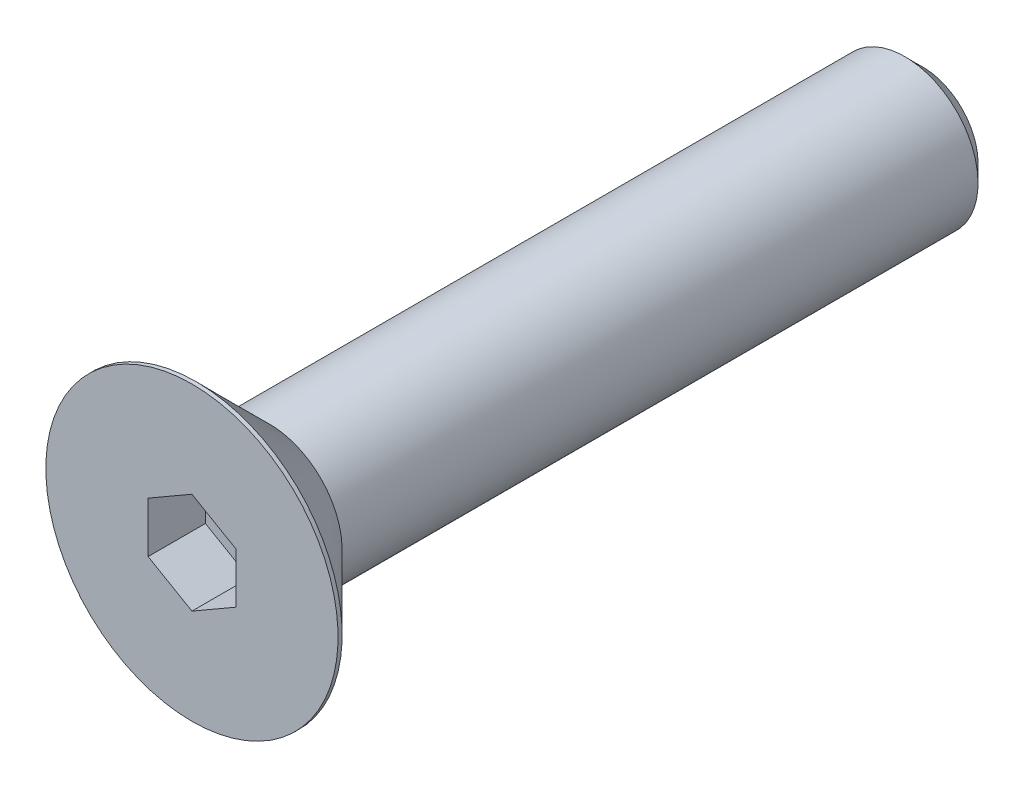
ISO-10303-21;
HEADER;
FILE_DESCRIPTION(('STEP AP214'),'2;1');
FILE_NAME('part.step','',(''),(''),'','','');
FILE_SCHEMA(('AUTOMOTIVE_DESIGN { 1 0 10303 214 1 1 1 1 }'));
ENDSEC;
DATA;
#1=APPLICATION_CONTEXT('core data for automotive mechanical design processes');
#2=APPLICATION_PROTOCOL_DEFINITION('international standard','automotive_design',2000,#1);
#3=PRODUCT_CONTEXT('',#1,'mechanical');
#4=PRODUCT('Part','Part','',(#3));
#5=PRODUCT_RELATED_PRODUCT_CATEGORY('part','',(#4));
#6=PRODUCT_DEFINITION_FORMATION('','',#4);
#7=PRODUCT_DEFINITION_CONTEXT('part definition',#1,'design');
#8=PRODUCT_DEFINITION('design','',#6,#7);
#9=PRODUCT_DEFINITION_SHAPE('','',#8);
#10=(LENGTH_UNIT() NAMED_UNIT(*) SI_UNIT(.MILLI.,.METRE.));
#11=(NAMED_UNIT(*) PLANE_ANGLE_UNIT() SI_UNIT($,.RADIAN.));
#12=(NAMED_UNIT(*) SI_UNIT($,.STERADIAN.) SOLID_ANGLE_UNIT());
#13=UNCERTAINTY_MEASURE_WITH_UNIT(LENGTH_MEASURE(1.E-05),#10,'distance_accuracy_value','');
#14=(GEOMETRIC_REPRESENTATION_CONTEXT(3) GLOBAL_UNCERTAINTY_ASSIGNED_CONTEXT((#13)) GLOBAL_UNIT_ASSIGNED_CONTEXT((#10,
#11,#12)) REPRESENTATION_CONTEXT('',''));
#15=CARTESIAN_POINT('',(0.,0.,0.));
#16=DIRECTION('',(0.,0.,1.));
#17=DIRECTION('',(1.,0.,0.));
#18=AXIS2_PLACEMENT_3D('',#15,#16,#17);
#19=CARTESIAN_POINT('',(0.,0.,12.36));
#20=DIRECTION('',(0.,0.,1.));
#21=DIRECTION('',(0.,-1.,0.));
#22=AXIS2_PLACEMENT_3D('',#19,#20,#21);
#23=CONICAL_SURFACE('',#22,5.,0.785398163397448);
#24=CARTESIAN_POINT('',(0.,0.,9.7));
#25=DIRECTION('',(0.,0.,1.));
#26=DIRECTION('',(0.,-1.,0.));
#27=AXIS2_PLACEMENT_3D('',#24,#25,#26);
#28=CIRCLE('',#27,2.34000000000001);
#29=CARTESIAN_POINT('',(0.,-2.34000000000001,9.7));
#30=VERTEX_POINT('',#29);
#31=EDGE_CURVE('E150',#30,#30,#28,.T.);
#32=ORIENTED_EDGE('',*,*,#31,.T.);
#33=EDGE_LOOP('',(#32));
#34=FACE_BOUND('',#33,.T.);
#35=CARTESIAN_POINT('',(0.,0.,12.36));
#36=DIRECTION('',(0.,0.,1.));
#37=DIRECTION('',(0.,-1.,0.));
#38=AXIS2_PLACEMENT_3D('',#35,#36,#37);
#39=CIRCLE('',#38,5.);
#40=CARTESIAN_POINT('',(0.,-5.,12.36));
#41=VERTEX_POINT('',#40);
#42=EDGE_CURVE('E12',#41,#41,#39,.T.);
#43=ORIENTED_EDGE('',*,*,#42,.F.);
#44=EDGE_LOOP('',(#43));
#45=FACE_BOUND('',#44,.T.);
#46=ADVANCED_FACE('F49',(#34,#45),#23,.T.);
#47=CARTESIAN_POINT('',(0.,0.,12.5));
#48=DIRECTION('',(0.,0.,1.));
#49=DIRECTION('',(0.,-1.,0.));
#50=AXIS2_PLACEMENT_3D('',#47,#48,#49);
#51=CYLINDRICAL_SURFACE('',#50,5.);
#52=ORIENTED_EDGE('',*,*,#42,.T.);
#53=EDGE_LOOP('',(#52));
#54=FACE_BOUND('',#53,.T.);
#55=CARTESIAN_POINT('',(0.,0.,12.5));
#56=DIRECTION('',(0.,0.,1.));
#57=DIRECTION('',(0.,-1.,0.));
#58=AXIS2_PLACEMENT_3D('',#55,#56,#57);
#59=CIRCLE('',#58,5.);
#60=CARTESIAN_POINT('',(0.,-5.,12.5));
#61=VERTEX_POINT('',#60);
#62=EDGE_CURVE('E56',#61,#61,#59,.T.);
#63=ORIENTED_EDGE('',*,*,#62,.F.);
#64=EDGE_LOOP('',(#63));
#65=FACE_BOUND('',#64,.T.);
#66=ADVANCED_FACE('F162',(#54,#65),#51,.T.);
#67=CARTESIAN_POINT('',(0.,0.,12.5));
#68=DIRECTION('',(0.,0.,-1.));
#69=DIRECTION('',(0.,1.,0.));
#70=AXIS2_PLACEMENT_3D('',#67,#68,#69);
#71=PLANE('',#70);
#72=DIRECTION('',(0.,1.,0.));
#73=VECTOR('',#72,1.);
#74=CARTESIAN_POINT('',(1.5,-0.86602540378444,12.5));
#75=LINE('',#74,#73);
#76=CARTESIAN_POINT('',(1.5,-0.86602540378444,12.5));
#77=VERTEX_POINT('',#76);
#78=CARTESIAN_POINT('',(1.5,0.866025403784438,12.5));
#79=VERTEX_POINT('',#78);
#80=EDGE_CURVE('E137',#77,#79,#75,.T.);
#81=ORIENTED_EDGE('',*,*,#80,.F.);
#82=DIRECTION('',(0.866025403784438,0.5,0.));
#83=VECTOR('',#82,1.);
#84=CARTESIAN_POINT('',(0.,-1.73205080756888,12.5));
#85=LINE('',#84,#83);
#86=CARTESIAN_POINT('',(0.,-1.73205080756888,12.5));
#87=VERTEX_POINT('',#86);
#88=EDGE_CURVE('E63',#87,#77,#85,.T.);
#89=ORIENTED_EDGE('',*,*,#88,.F.);
#90=DIRECTION('',(0.866025403784439,-0.5,0.));
#91=VECTOR('',#90,1.);
#92=CARTESIAN_POINT('',(-1.5,-0.866025403784442,12.5));
#93=LINE('',#92,#91);
#94=CARTESIAN_POINT('',(-1.5,-0.866025403784442,12.5));
#95=VERTEX_POINT('',#94);
#96=EDGE_CURVE('E146',#95,#87,#93,.T.);
#97=ORIENTED_EDGE('',*,*,#96,.F.);
#98=DIRECTION('',(0.,-1.,0.));
#99=VECTOR('',#98,1.);
#100=CARTESIAN_POINT('',(-1.5,0.866025403784437,12.5));
#101=LINE('',#100,#99);
#102=CARTESIAN_POINT('',(-1.5,0.866025403784437,12.5));
#103=VERTEX_POINT('',#102);
#104=EDGE_CURVE('E144',#103,#95,#101,.T.);
#105=ORIENTED_EDGE('',*,*,#104,.F.);
#106=DIRECTION('',(-0.866025403784439,-0.5,0.));
#107=VECTOR('',#106,1.);
#108=CARTESIAN_POINT('',(0.,1.73205080756888,12.5));
#109=LINE('',#108,#107);
#110=CARTESIAN_POINT('',(0.,1.73205080756888,12.5));
#111=VERTEX_POINT('',#110);
#112=EDGE_CURVE('E111',#111,#103,#109,.T.);
#113=ORIENTED_EDGE('',*,*,#112,.F.);
#114=DIRECTION('',(-0.866025403784439,0.5,0.));
#115=VECTOR('',#114,1.);
#116=CARTESIAN_POINT('',(1.5,0.866025403784438,12.5));
#117=LINE('',#116,#115);
#118=EDGE_CURVE('E140',#79,#111,#117,.T.);
#119=ORIENTED_EDGE('',*,*,#118,.F.);
#120=EDGE_LOOP('',(#81,#89,#97,#105,#113,#119));
#121=FACE_BOUND('',#120,.T.);
#122=ORIENTED_EDGE('',*,*,#62,.T.);
#123=EDGE_LOOP('',(#122));
#124=FACE_BOUND('',#123,.T.);
#125=ADVANCED_FACE('F160',(#121,#124),#71,.F.);
#126=CARTESIAN_POINT('',(0.,0.,9.7));
#127=DIRECTION('',(0.,0.,-1.));
#128=DIRECTION('',(0.,1.,0.));
#129=AXIS2_PLACEMENT_3D('',#126,#127,#128);
#130=PLANE('',#129);
#131=ORIENTED_EDGE('',*,*,#31,.F.);
#132=EDGE_LOOP('',(#131));
#133=FACE_BOUND('',#132,.T.);
#134=ADVANCED_FACE('F169',(#133),#130,.T.);
#135=CARTESIAN_POINT('',(0.,-1.73205080756888,10.54));
#136=DIRECTION('',(0.5,-0.866025403784438,0.));
#137=DIRECTION('',(0.866025403784438,0.5,0.));
#138=AXIS2_PLACEMENT_3D('',#135,#136,#137);
#139=PLANE('',#138);
#140=ORIENTED_EDGE('',*,*,#88,.T.);
#141=DIRECTION('',(0.,0.,1.));
#142=VECTOR('',#141,1.);
#143=CARTESIAN_POINT('',(1.5,-0.86602540378444,10.54));
#144=LINE('',#143,#142);
#145=CARTESIAN_POINT('',(1.5,-0.86602540378444,10.54));
#146=VERTEX_POINT('',#145);
#147=EDGE_CURVE('E93',#146,#77,#144,.T.);
#148=ORIENTED_EDGE('',*,*,#147,.F.);
#149=DIRECTION('',(0.866025403784438,0.5,0.));
#150=VECTOR('',#149,1.);
#151=CARTESIAN_POINT('',(0.,-1.73205080756888,10.54));
#152=LINE('',#151,#150);
#153=CARTESIAN_POINT('',(0.,-1.73205080756888,10.54));
#154=VERTEX_POINT('',#153);
#155=EDGE_CURVE('E148',#154,#146,#152,.T.);
#156=ORIENTED_EDGE('',*,*,#155,.F.);
#157=DIRECTION('',(0.,0.,1.));
#158=VECTOR('',#157,1.);
#159=CARTESIAN_POINT('',(0.,-1.73205080756888,10.54));
#160=LINE('',#159,#158);
#161=EDGE_CURVE('E71',#154,#87,#160,.T.);
#162=ORIENTED_EDGE('',*,*,#161,.T.);
#163=EDGE_LOOP('',(#140,#148,#156,#162));
#164=FACE_BOUND('',#163,.T.);
#165=ADVANCED_FACE('F176',(#164),#139,.F.);
#166=CARTESIAN_POINT('',(-1.5,-0.866025403784442,10.54));
#167=DIRECTION('',(-0.5,-0.866025403784439,0.));
#168=DIRECTION('',(0.866025403784439,-0.5,0.));
#169=AXIS2_PLACEMENT_3D('',#166,#167,#168);
#170=PLANE('',#169);
#171=ORIENTED_EDGE('',*,*,#96,.T.);
#172=ORIENTED_EDGE('',*,*,#161,.F.);
#173=DIRECTION('',(0.866025403784439,-0.5,0.));
#174=VECTOR('',#173,1.);
#175=CARTESIAN_POINT('',(-1.5,-0.866025403784442,10.54));
#176=LINE('',#175,#174);
#177=CARTESIAN_POINT('',(-1.5,-0.866025403784442,10.54));
#178=VERTEX_POINT('',#177);
#179=EDGE_CURVE('E123',#178,#154,#176,.T.);
#180=ORIENTED_EDGE('',*,*,#179,.F.);
#181=DIRECTION('',(0.,0.,1.));
#182=VECTOR('',#181,1.);
#183=CARTESIAN_POINT('',(-1.5,-0.866025403784442,10.54));
#184=LINE('',#183,#182);
#185=EDGE_CURVE('E115',#178,#95,#184,.T.);
#186=ORIENTED_EDGE('',*,*,#185,.T.);
#187=EDGE_LOOP('',(#171,#172,#180,#186));
#188=FACE_BOUND('',#187,.T.);
#189=ADVANCED_FACE('F180',(#188),#170,.F.);
#190=CARTESIAN_POINT('',(-1.5,0.866025403784437,10.54));
#191=DIRECTION('',(-1.,0.,0.));
#192=DIRECTION('',(0.,-1.,0.));
#193=AXIS2_PLACEMENT_3D('',#190,#191,#192);
#194=PLANE('',#193);
#195=ORIENTED_EDGE('',*,*,#104,.T.);
#196=ORIENTED_EDGE('',*,*,#185,.F.);
#197=DIRECTION('',(0.,-1.,0.));
#198=VECTOR('',#197,1.);
#199=CARTESIAN_POINT('',(-1.5,0.866025403784437,10.54));
#200=LINE('',#199,#198);
#201=CARTESIAN_POINT('',(-1.5,0.866025403784437,10.54));
#202=VERTEX_POINT('',#201);
#203=EDGE_CURVE('E119',#202,#178,#200,.T.);
#204=ORIENTED_EDGE('',*,*,#203,.F.);
#205=DIRECTION('',(0.,0.,1.));
#206=VECTOR('',#205,1.);
#207=CARTESIAN_POINT('',(-1.5,0.866025403784437,10.54));
#208=LINE('',#207,#206);
#209=EDGE_CURVE('E104',#202,#103,#208,.T.);
#210=ORIENTED_EDGE('',*,*,#209,.T.);
#211=EDGE_LOOP('',(#195,#196,#204,#210));
#212=FACE_BOUND('',#211,.T.);
#213=ADVANCED_FACE('F120',(#212),#194,.F.);
#214=CARTESIAN_POINT('',(0.,1.73205080756888,10.54));
#215=DIRECTION('',(-0.5,0.866025403784438,0.));
#216=DIRECTION('',(-0.866025403784439,-0.5,0.));
#217=AXIS2_PLACEMENT_3D('',#214,#215,#216);
#218=PLANE('',#217);
#219=ORIENTED_EDGE('',*,*,#112,.T.);
#220=ORIENTED_EDGE('',*,*,#209,.F.);
#221=DIRECTION('',(-0.866025403784439,-0.5,0.));
#222=VECTOR('',#221,1.);
#223=CARTESIAN_POINT('',(0.,1.73205080756888,10.54));
#224=LINE('',#223,#222);
#225=CARTESIAN_POINT('',(0.,1.73205080756888,10.54));
#226=VERTEX_POINT('',#225);
#227=EDGE_CURVE('E108',#226,#202,#224,.T.);
#228=ORIENTED_EDGE('',*,*,#227,.F.);
#229=DIRECTION('',(0.,0.,1.));
#230=VECTOR('',#229,1.);
#231=CARTESIAN_POINT('',(0.,1.73205080756888,10.54));
#232=LINE('',#231,#230);
#233=EDGE_CURVE('E116',#226,#111,#232,.T.);
#234=ORIENTED_EDGE('',*,*,#233,.T.);
#235=EDGE_LOOP('',(#219,#220,#228,#234));
#236=FACE_BOUND('',#235,.T.);
#237=ADVANCED_FACE('F106',(#236),#218,.F.);
#238=CARTESIAN_POINT('',(1.5,0.866025403784438,10.54));
#239=DIRECTION('',(0.5,0.866025403784439,0.));
#240=DIRECTION('',(-0.866025403784439,0.5,0.));
#241=AXIS2_PLACEMENT_3D('',#238,#239,#240);
#242=PLANE('',#241);
#243=ORIENTED_EDGE('',*,*,#118,.T.);
#244=ORIENTED_EDGE('',*,*,#233,.F.);
#245=DIRECTION('',(-0.866025403784439,0.5,0.));
#246=VECTOR('',#245,1.);
#247=CARTESIAN_POINT('',(1.5,0.866025403784438,10.54));
#248=LINE('',#247,#246);
#249=CARTESIAN_POINT('',(1.5,0.866025403784438,10.54));
#250=VERTEX_POINT('',#249);
#251=EDGE_CURVE('E129',#250,#226,#248,.T.);
#252=ORIENTED_EDGE('',*,*,#251,.F.);
#253=DIRECTION('',(0.,0.,1.));
#254=VECTOR('',#253,1.);
#255=CARTESIAN_POINT('',(1.5,0.866025403784438,10.54));
#256=LINE('',#255,#254);
#257=EDGE_CURVE('E153',#250,#79,#256,.T.);
#258=ORIENTED_EDGE('',*,*,#257,.T.);
#259=EDGE_LOOP('',(#243,#244,#252,#258));
#260=FACE_BOUND('',#259,.T.);
#261=ADVANCED_FACE('F184',(#260),#242,.F.);
#262=CARTESIAN_POINT('',(1.5,-0.86602540378444,10.54));
#263=DIRECTION('',(1.,0.,0.));
#264=DIRECTION('',(0.,0.,-1.));
#265=AXIS2_PLACEMENT_3D('',#262,#263,#264);
#266=PLANE('',#265);
#267=ORIENTED_EDGE('',*,*,#80,.T.);
#268=ORIENTED_EDGE('',*,*,#257,.F.);
#269=DIRECTION('',(0.,1.,0.));
#270=VECTOR('',#269,1.);
#271=CARTESIAN_POINT('',(1.5,-0.86602540378444,10.54));
#272=LINE('',#271,#270);
#273=EDGE_CURVE('E131',#146,#250,#272,.T.);
#274=ORIENTED_EDGE('',*,*,#273,.F.);
#275=ORIENTED_EDGE('',*,*,#147,.T.);
#276=EDGE_LOOP('',(#267,#268,#274,#275));
#277=FACE_BOUND('',#276,.T.);
#278=ADVANCED_FACE('F181',(#277),#266,.F.);
#279=CARTESIAN_POINT('',(1.5,-0.86602540378444,10.54));
#280=DIRECTION('',(0.,0.,1.));
#281=DIRECTION('',(1.,0.,0.));
#282=AXIS2_PLACEMENT_3D('',#279,#280,#281);
#283=PLANE('',#282);
#284=ORIENTED_EDGE('',*,*,#155,.T.);
#285=ORIENTED_EDGE('',*,*,#273,.T.);
#286=ORIENTED_EDGE('',*,*,#251,.T.);
#287=ORIENTED_EDGE('',*,*,#227,.T.);
#288=ORIENTED_EDGE('',*,*,#203,.T.);
#289=ORIENTED_EDGE('',*,*,#179,.T.);
#290=EDGE_LOOP('',(#284,#285,#286,#287,#288,#289));
#291=FACE_BOUND('',#290,.T.);
#292=ADVANCED_FACE('F126',(#291),#283,.T.);
#293=CLOSED_SHELL('',(#46,#66,#125,#134,#165,#189,#213,#237,#261,#278,#292));
#294=MANIFOLD_SOLID_BREP('B2',#293);
#295=CARTESIAN_POINT('',(0.,-2.50000000000001,10.54));
#296=DIRECTION('',(0.,0.,-1.));
#297=DIRECTION('',(0.,1.,0.));
#298=AXIS2_PLACEMENT_3D('',#295,#296,#297);
#299=PLANE('',#298);
#300=CARTESIAN_POINT('',(0.,0.,10.54));
#301=DIRECTION('',(0.,0.,1.));
#302=DIRECTION('',(0.,-1.,0.));
#303=AXIS2_PLACEMENT_3D('',#300,#301,#302);
#304=CIRCLE('',#303,2.50000000000001);
#305=CARTESIAN_POINT('',(0.,-2.50000000000001,10.54));
#306=VERTEX_POINT('',#305);
#307=EDGE_CURVE('E283',#306,#306,#304,.T.);
#308=ORIENTED_EDGE('',*,*,#307,.T.);
#309=EDGE_LOOP('',(#308));
#310=FACE_BOUND('',#309,.T.);
#311=ADVANCED_FACE('F270',(#310),#299,.F.);
#312=CARTESIAN_POINT('',(0.,-2.5,-12.5));
#313=DIRECTION('',(0.,0.,1.));
#314=DIRECTION('',(0.,-1.,0.));
#315=AXIS2_PLACEMENT_3D('',#312,#313,#314);
#316=PLANE('',#315);
#317=CARTESIAN_POINT('',(0.,0.,-12.5));
#318=DIRECTION('',(0.,0.,1.));
#319=DIRECTION('',(0.,-1.,0.));
#320=AXIS2_PLACEMENT_3D('',#317,#318,#319);
#321=CIRCLE('',#320,1.90000000000001);
#322=CARTESIAN_POINT('',(0.,-1.90000000000001,-12.5));
#323=VERTEX_POINT('',#322);
#324=EDGE_CURVE('E48',#323,#323,#321,.F.);
#325=ORIENTED_EDGE('',*,*,#324,.T.);
#326=EDGE_LOOP('',(#325));
#327=FACE_BOUND('',#326,.T.);
#328=ADVANCED_FACE('F294',(#327),#316,.F.);
#329=CARTESIAN_POINT('',(0.,0.,10.54));
#330=DIRECTION('',(0.,0.,1.));
#331=DIRECTION('',(0.,-1.,0.));
#332=AXIS2_PLACEMENT_3D('',#329,#330,#331);
#333=CYLINDRICAL_SURFACE('',#332,2.50000000000001);
#334=CARTESIAN_POINT('',(0.,0.,-11.9));
#335=DIRECTION('',(0.,0.,1.));
#336=DIRECTION('',(0.,-1.,0.));
#337=AXIS2_PLACEMENT_3D('',#334,#335,#336);
#338=CIRCLE('',#337,2.50000000000001);
#339=CARTESIAN_POINT('',(0.,-2.50000000000001,-11.9));
#340=VERTEX_POINT('',#339);
#341=EDGE_CURVE('E278',#340,#340,#338,.T.);
#342=ORIENTED_EDGE('',*,*,#341,.T.);
#343=EDGE_LOOP('',(#342));
#344=FACE_BOUND('',#343,.T.);
#345=ORIENTED_EDGE('',*,*,#307,.F.);
#346=EDGE_LOOP('',(#345));
#347=FACE_BOUND('',#346,.T.);
#348=ADVANCED_FACE('F292',(#344,#347),#333,.T.);
#349=CARTESIAN_POINT('',(0.,0.,-11.9));
#350=DIRECTION('',(0.,0.,1.));
#351=DIRECTION('',(0.,-1.,0.));
#352=AXIS2_PLACEMENT_3D('',#349,#350,#351);
#353=CONICAL_SURFACE('',#352,2.50000000000001,0.785398163397448);
#354=ORIENTED_EDGE('',*,*,#324,.F.);
#355=EDGE_LOOP('',(#354));
#356=FACE_BOUND('',#355,.T.);
#357=ORIENTED_EDGE('',*,*,#341,.F.);
#358=EDGE_LOOP('',(#357));
#359=FACE_BOUND('',#358,.T.);
#360=ADVANCED_FACE('F272',(#356,#359),#353,.T.);
#361=CLOSED_SHELL('',(#311,#328,#348,#360));
#362=MANIFOLD_SOLID_BREP('B6',#361);
#363=ADVANCED_BREP_SHAPE_REPRESENTATION('',(#18,#294,#362),#14);
#364=SHAPE_DEFINITION_REPRESENTATION(#9,#363);
ENDSEC;
END-ISO-10303-21;
